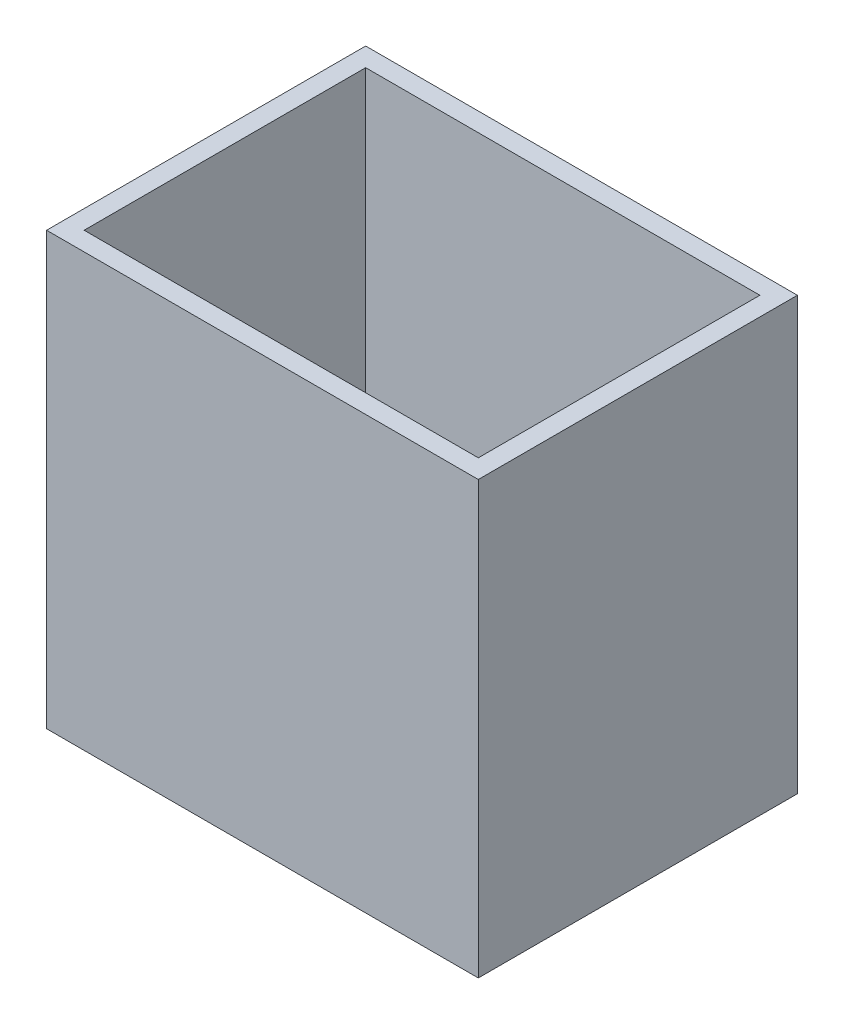
ISO-10303-21;
HEADER;
FILE_DESCRIPTION(('STEP AP214'),'2;1');
FILE_NAME('part.step','',(''),(''),'','','');
FILE_SCHEMA(('AUTOMOTIVE_DESIGN { 1 0 10303 214 1 1 1 1 }'));
ENDSEC;
DATA;
#1=APPLICATION_CONTEXT('core data for automotive mechanical design processes');
#2=APPLICATION_PROTOCOL_DEFINITION('international standard','automotive_design',2000,#1);
#3=PRODUCT_CONTEXT('',#1,'mechanical');
#4=PRODUCT('Part','Part','',(#3));
#5=PRODUCT_RELATED_PRODUCT_CATEGORY('part','',(#4));
#6=PRODUCT_DEFINITION_FORMATION('','',#4);
#7=PRODUCT_DEFINITION_CONTEXT('part definition',#1,'design');
#8=PRODUCT_DEFINITION('design','',#6,#7);
#9=PRODUCT_DEFINITION_SHAPE('','',#8);
#10=(LENGTH_UNIT() NAMED_UNIT(*) SI_UNIT(.MILLI.,.METRE.));
#11=(NAMED_UNIT(*) PLANE_ANGLE_UNIT() SI_UNIT($,.RADIAN.));
#12=(NAMED_UNIT(*) SI_UNIT($,.STERADIAN.) SOLID_ANGLE_UNIT());
#13=UNCERTAINTY_MEASURE_WITH_UNIT(LENGTH_MEASURE(1.E-05),#10,'distance_accuracy_value','');
#14=(GEOMETRIC_REPRESENTATION_CONTEXT(3) GLOBAL_UNCERTAINTY_ASSIGNED_CONTEXT((#13)) GLOBAL_UNIT_ASSIGNED_CONTEXT((#10,
#11,#12)) REPRESENTATION_CONTEXT('',''));
#15=CARTESIAN_POINT('',(0.,0.,0.));
#16=DIRECTION('',(0.,0.,1.));
#17=DIRECTION('',(1.,0.,0.));
#18=AXIS2_PLACEMENT_3D('',#15,#16,#17);
#19=CARTESIAN_POINT('',(-23.,0.,17.));
#20=DIRECTION('',(0.,1.,0.));
#21=DIRECTION('',(0.,0.,1.));
#22=AXIS2_PLACEMENT_3D('',#19,#20,#21);
#23=PLANE('',#22);
#24=DIRECTION('',(1.,0.,0.));
#25=VECTOR('',#24,1.);
#26=CARTESIAN_POINT('',(-23.,0.,-17.));
#27=LINE('',#26,#25);
#28=CARTESIAN_POINT('',(-23.,0.,-17.));
#29=VERTEX_POINT('',#28);
#30=CARTESIAN_POINT('',(23.,0.,-17.));
#31=VERTEX_POINT('',#30);
#32=EDGE_CURVE('E141',#29,#31,#27,.T.);
#33=ORIENTED_EDGE('',*,*,#32,.T.);
#34=DIRECTION('',(0.,0.,-1.));
#35=VECTOR('',#34,1.);
#36=CARTESIAN_POINT('',(23.,0.,17.));
#37=LINE('',#36,#35);
#38=CARTESIAN_POINT('',(23.,0.,17.));
#39=VERTEX_POINT('',#38);
#40=EDGE_CURVE('E126',#39,#31,#37,.T.);
#41=ORIENTED_EDGE('',*,*,#40,.F.);
#42=DIRECTION('',(1.,0.,0.));
#43=VECTOR('',#42,1.);
#44=CARTESIAN_POINT('',(-23.,0.,17.));
#45=LINE('',#44,#43);
#46=CARTESIAN_POINT('',(-23.,0.,17.));
#47=VERTEX_POINT('',#46);
#48=EDGE_CURVE('E149',#47,#39,#45,.T.);
#49=ORIENTED_EDGE('',*,*,#48,.F.);
#50=DIRECTION('',(0.,0.,-1.));
#51=VECTOR('',#50,1.);
#52=CARTESIAN_POINT('',(-23.,0.,17.));
#53=LINE('',#52,#51);
#54=EDGE_CURVE('E110',#47,#29,#53,.T.);
#55=ORIENTED_EDGE('',*,*,#54,.T.);
#56=EDGE_LOOP('',(#33,#41,#49,#55));
#57=FACE_BOUND('',#56,.T.);
#58=DIRECTION('',(-1.,0.,0.));
#59=VECTOR('',#58,1.);
#60=CARTESIAN_POINT('',(-23.,0.,15.));
#61=LINE('',#60,#59);
#62=CARTESIAN_POINT('',(21.,0.,15.));
#63=VERTEX_POINT('',#62);
#64=CARTESIAN_POINT('',(-21.,0.,15.));
#65=VERTEX_POINT('',#64);
#66=EDGE_CURVE('E156',#63,#65,#61,.T.);
#67=ORIENTED_EDGE('',*,*,#66,.F.);
#68=DIRECTION('',(0.,0.,1.));
#69=VECTOR('',#68,1.);
#70=CARTESIAN_POINT('',(21.,0.,17.));
#71=LINE('',#70,#69);
#72=CARTESIAN_POINT('',(21.,0.,-15.));
#73=VERTEX_POINT('',#72);
#74=EDGE_CURVE('E154',#73,#63,#71,.T.);
#75=ORIENTED_EDGE('',*,*,#74,.F.);
#76=DIRECTION('',(-1.,0.,0.));
#77=VECTOR('',#76,1.);
#78=CARTESIAN_POINT('',(-23.,0.,-15.));
#79=LINE('',#78,#77);
#80=CARTESIAN_POINT('',(-21.,0.,-15.));
#81=VERTEX_POINT('',#80);
#82=EDGE_CURVE('E158',#73,#81,#79,.T.);
#83=ORIENTED_EDGE('',*,*,#82,.T.);
#84=DIRECTION('',(0.,0.,-1.));
#85=VECTOR('',#84,1.);
#86=CARTESIAN_POINT('',(-21.,0.,17.));
#87=LINE('',#86,#85);
#88=EDGE_CURVE('E117',#65,#81,#87,.T.);
#89=ORIENTED_EDGE('',*,*,#88,.F.);
#90=EDGE_LOOP('',(#67,#75,#83,#89));
#91=FACE_BOUND('',#90,.T.);
#92=ADVANCED_FACE('F43',(#57,#91),#23,.F.);
#93=CARTESIAN_POINT('',(-23.,46.,17.));
#94=DIRECTION('',(0.,-1.,0.));
#95=DIRECTION('',(0.,0.,-1.));
#96=AXIS2_PLACEMENT_3D('',#93,#94,#95);
#97=PLANE('',#96);
#98=DIRECTION('',(-1.,0.,0.));
#99=VECTOR('',#98,1.);
#100=CARTESIAN_POINT('',(-23.,46.,-17.));
#101=LINE('',#100,#99);
#102=CARTESIAN_POINT('',(23.,46.,-17.));
#103=VERTEX_POINT('',#102);
#104=CARTESIAN_POINT('',(-23.,46.,-17.));
#105=VERTEX_POINT('',#104);
#106=EDGE_CURVE('E136',#103,#105,#101,.T.);
#107=ORIENTED_EDGE('',*,*,#106,.T.);
#108=DIRECTION('',(0.,0.,-1.));
#109=VECTOR('',#108,1.);
#110=CARTESIAN_POINT('',(-23.,46.,17.));
#111=LINE('',#110,#109);
#112=CARTESIAN_POINT('',(-23.,46.,17.));
#113=VERTEX_POINT('',#112);
#114=EDGE_CURVE('E132',#113,#105,#111,.T.);
#115=ORIENTED_EDGE('',*,*,#114,.F.);
#116=DIRECTION('',(-1.,0.,0.));
#117=VECTOR('',#116,1.);
#118=CARTESIAN_POINT('',(-23.,46.,17.));
#119=LINE('',#118,#117);
#120=CARTESIAN_POINT('',(23.,46.,17.));
#121=VERTEX_POINT('',#120);
#122=EDGE_CURVE('E135',#121,#113,#119,.T.);
#123=ORIENTED_EDGE('',*,*,#122,.F.);
#124=DIRECTION('',(0.,0.,-1.));
#125=VECTOR('',#124,1.);
#126=CARTESIAN_POINT('',(23.,46.,17.));
#127=LINE('',#126,#125);
#128=EDGE_CURVE('E129',#121,#103,#127,.T.);
#129=ORIENTED_EDGE('',*,*,#128,.T.);
#130=EDGE_LOOP('',(#107,#115,#123,#129));
#131=FACE_BOUND('',#130,.T.);
#132=DIRECTION('',(1.,0.,0.));
#133=VECTOR('',#132,1.);
#134=CARTESIAN_POINT('',(-23.,46.,15.));
#135=LINE('',#134,#133);
#136=CARTESIAN_POINT('',(-21.,46.,15.));
#137=VERTEX_POINT('',#136);
#138=CARTESIAN_POINT('',(21.,46.,15.));
#139=VERTEX_POINT('',#138);
#140=EDGE_CURVE('E11',#137,#139,#135,.T.);
#141=ORIENTED_EDGE('',*,*,#140,.F.);
#142=DIRECTION('',(0.,0.,1.));
#143=VECTOR('',#142,1.);
#144=CARTESIAN_POINT('',(-21.,46.,17.));
#145=LINE('',#144,#143);
#146=CARTESIAN_POINT('',(-21.,46.,-15.));
#147=VERTEX_POINT('',#146);
#148=EDGE_CURVE('E51',#147,#137,#145,.T.);
#149=ORIENTED_EDGE('',*,*,#148,.F.);
#150=DIRECTION('',(1.,0.,0.));
#151=VECTOR('',#150,1.);
#152=CARTESIAN_POINT('',(-23.,46.,-15.));
#153=LINE('',#152,#151);
#154=CARTESIAN_POINT('',(21.,46.,-15.));
#155=VERTEX_POINT('',#154);
#156=EDGE_CURVE('E104',#147,#155,#153,.T.);
#157=ORIENTED_EDGE('',*,*,#156,.T.);
#158=DIRECTION('',(0.,0.,-1.));
#159=VECTOR('',#158,1.);
#160=CARTESIAN_POINT('',(21.,46.,17.));
#161=LINE('',#160,#159);
#162=EDGE_CURVE('E109',#139,#155,#161,.T.);
#163=ORIENTED_EDGE('',*,*,#162,.F.);
#164=EDGE_LOOP('',(#141,#149,#157,#163));
#165=FACE_BOUND('',#164,.T.);
#166=ADVANCED_FACE('F121',(#131,#165),#97,.F.);
#167=CARTESIAN_POINT('',(-23.,0.,17.));
#168=DIRECTION('',(1.,0.,0.));
#169=DIRECTION('',(0.,0.,-1.));
#170=AXIS2_PLACEMENT_3D('',#167,#168,#169);
#171=PLANE('',#170);
#172=DIRECTION('',(0.,-1.,0.));
#173=VECTOR('',#172,1.);
#174=CARTESIAN_POINT('',(-23.,0.,-17.));
#175=LINE('',#174,#173);
#176=EDGE_CURVE('E143',#105,#29,#175,.T.);
#177=ORIENTED_EDGE('',*,*,#176,.T.);
#178=ORIENTED_EDGE('',*,*,#54,.F.);
#179=DIRECTION('',(0.,-1.,0.));
#180=VECTOR('',#179,1.);
#181=CARTESIAN_POINT('',(-23.,0.,17.));
#182=LINE('',#181,#180);
#183=EDGE_CURVE('E138',#113,#47,#182,.T.);
#184=ORIENTED_EDGE('',*,*,#183,.F.);
#185=ORIENTED_EDGE('',*,*,#114,.T.);
#186=EDGE_LOOP('',(#177,#178,#184,#185));
#187=FACE_BOUND('',#186,.T.);
#188=ADVANCED_FACE('F45',(#187),#171,.F.);
#189=CARTESIAN_POINT('',(23.,0.,17.));
#190=DIRECTION('',(-1.,0.,0.));
#191=DIRECTION('',(0.,0.,1.));
#192=AXIS2_PLACEMENT_3D('',#189,#190,#191);
#193=PLANE('',#192);
#194=DIRECTION('',(0.,1.,0.));
#195=VECTOR('',#194,1.);
#196=CARTESIAN_POINT('',(23.,0.,-17.));
#197=LINE('',#196,#195);
#198=EDGE_CURVE('E139',#31,#103,#197,.T.);
#199=ORIENTED_EDGE('',*,*,#198,.T.);
#200=ORIENTED_EDGE('',*,*,#128,.F.);
#201=DIRECTION('',(0.,1.,0.));
#202=VECTOR('',#201,1.);
#203=CARTESIAN_POINT('',(23.,0.,17.));
#204=LINE('',#203,#202);
#205=EDGE_CURVE('E147',#39,#121,#204,.T.);
#206=ORIENTED_EDGE('',*,*,#205,.F.);
#207=ORIENTED_EDGE('',*,*,#40,.T.);
#208=EDGE_LOOP('',(#199,#200,#206,#207));
#209=FACE_BOUND('',#208,.T.);
#210=ADVANCED_FACE('F187',(#209),#193,.F.);
#211=CARTESIAN_POINT('',(0.,0.,17.));
#212=DIRECTION('',(0.,0.,-1.));
#213=DIRECTION('',(-1.,0.,0.));
#214=AXIS2_PLACEMENT_3D('',#211,#212,#213);
#215=PLANE('',#214);
#216=ORIENTED_EDGE('',*,*,#183,.T.);
#217=ORIENTED_EDGE('',*,*,#48,.T.);
#218=ORIENTED_EDGE('',*,*,#205,.T.);
#219=ORIENTED_EDGE('',*,*,#122,.T.);
#220=EDGE_LOOP('',(#216,#217,#218,#219));
#221=FACE_BOUND('',#220,.T.);
#222=ADVANCED_FACE('F189',(#221),#215,.F.);
#223=CARTESIAN_POINT('',(0.,0.,-17.));
#224=DIRECTION('',(0.,0.,-1.));
#225=DIRECTION('',(-1.,0.,0.));
#226=AXIS2_PLACEMENT_3D('',#223,#224,#225);
#227=PLANE('',#226);
#228=ORIENTED_EDGE('',*,*,#176,.F.);
#229=ORIENTED_EDGE('',*,*,#106,.F.);
#230=ORIENTED_EDGE('',*,*,#198,.F.);
#231=ORIENTED_EDGE('',*,*,#32,.F.);
#232=EDGE_LOOP('',(#228,#229,#230,#231));
#233=FACE_BOUND('',#232,.T.);
#234=ADVANCED_FACE('F192',(#233),#227,.T.);
#235=CARTESIAN_POINT('',(-21.,-1.,15.));
#236=DIRECTION('',(1.,0.,0.));
#237=DIRECTION('',(0.,0.,-1.));
#238=AXIS2_PLACEMENT_3D('',#235,#236,#237);
#239=PLANE('',#238);
#240=ORIENTED_EDGE('',*,*,#88,.T.);
#241=DIRECTION('',(0.,-1.,0.));
#242=VECTOR('',#241,1.);
#243=CARTESIAN_POINT('',(-21.,-1.,-15.));
#244=LINE('',#243,#242);
#245=EDGE_CURVE('E58',#147,#81,#244,.T.);
#246=ORIENTED_EDGE('',*,*,#245,.F.);
#247=ORIENTED_EDGE('',*,*,#148,.T.);
#248=DIRECTION('',(0.,-1.,0.));
#249=VECTOR('',#248,1.);
#250=CARTESIAN_POINT('',(-21.,-1.,15.));
#251=LINE('',#250,#249);
#252=EDGE_CURVE('E161',#137,#65,#251,.T.);
#253=ORIENTED_EDGE('',*,*,#252,.T.);
#254=EDGE_LOOP('',(#240,#246,#247,#253));
#255=FACE_BOUND('',#254,.T.);
#256=ADVANCED_FACE('F113',(#255),#239,.T.);
#257=CARTESIAN_POINT('',(21.,-1.,15.));
#258=DIRECTION('',(-1.,0.,0.));
#259=DIRECTION('',(0.,0.,1.));
#260=AXIS2_PLACEMENT_3D('',#257,#258,#259);
#261=PLANE('',#260);
#262=ORIENTED_EDGE('',*,*,#74,.T.);
#263=DIRECTION('',(0.,1.,0.));
#264=VECTOR('',#263,1.);
#265=CARTESIAN_POINT('',(21.,-1.,15.));
#266=LINE('',#265,#264);
#267=EDGE_CURVE('E160',#63,#139,#266,.T.);
#268=ORIENTED_EDGE('',*,*,#267,.T.);
#269=ORIENTED_EDGE('',*,*,#162,.T.);
#270=DIRECTION('',(0.,1.,0.));
#271=VECTOR('',#270,1.);
#272=CARTESIAN_POINT('',(21.,-1.,-15.));
#273=LINE('',#272,#271);
#274=EDGE_CURVE('E63',#73,#155,#273,.T.);
#275=ORIENTED_EDGE('',*,*,#274,.F.);
#276=EDGE_LOOP('',(#262,#268,#269,#275));
#277=FACE_BOUND('',#276,.T.);
#278=ADVANCED_FACE('F170',(#277),#261,.T.);
#279=CARTESIAN_POINT('',(0.,0.,15.));
#280=DIRECTION('',(0.,0.,-1.));
#281=DIRECTION('',(-1.,0.,0.));
#282=AXIS2_PLACEMENT_3D('',#279,#280,#281);
#283=PLANE('',#282);
#284=ORIENTED_EDGE('',*,*,#66,.T.);
#285=ORIENTED_EDGE('',*,*,#252,.F.);
#286=ORIENTED_EDGE('',*,*,#140,.T.);
#287=ORIENTED_EDGE('',*,*,#267,.F.);
#288=EDGE_LOOP('',(#284,#285,#286,#287));
#289=FACE_BOUND('',#288,.T.);
#290=ADVANCED_FACE('F172',(#289),#283,.T.);
#291=CARTESIAN_POINT('',(0.,0.,-15.));
#292=DIRECTION('',(0.,0.,-1.));
#293=DIRECTION('',(-1.,0.,0.));
#294=AXIS2_PLACEMENT_3D('',#291,#292,#293);
#295=PLANE('',#294);
#296=ORIENTED_EDGE('',*,*,#274,.T.);
#297=ORIENTED_EDGE('',*,*,#156,.F.);
#298=ORIENTED_EDGE('',*,*,#245,.T.);
#299=ORIENTED_EDGE('',*,*,#82,.F.);
#300=EDGE_LOOP('',(#296,#297,#298,#299));
#301=FACE_BOUND('',#300,.T.);
#302=ADVANCED_FACE('F105',(#301),#295,.F.);
#303=CLOSED_SHELL('',(#92,#166,#188,#210,#222,#234,#256,#278,#290,#302));
#304=MANIFOLD_SOLID_BREP('B2',#303);
#305=ADVANCED_BREP_SHAPE_REPRESENTATION('',(#18,#304),#14);
#306=SHAPE_DEFINITION_REPRESENTATION(#9,#305);
ENDSEC;
END-ISO-10303-21;
